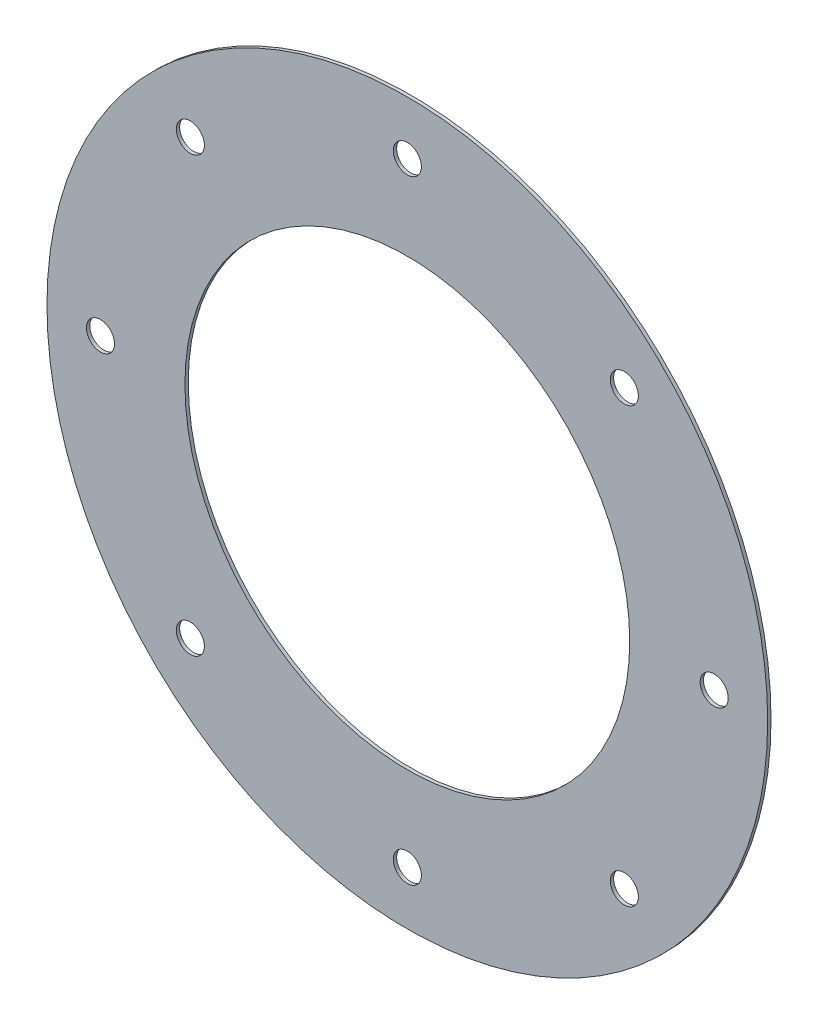
ISO-10303-21;
HEADER;
FILE_DESCRIPTION(('STEP AP214'),'2;1');
FILE_NAME('part.step','',(''),(''),'','','');
FILE_SCHEMA(('AUTOMOTIVE_DESIGN { 1 0 10303 214 1 1 1 1 }'));
ENDSEC;
DATA;
#1=APPLICATION_CONTEXT('core data for automotive mechanical design processes');
#2=APPLICATION_PROTOCOL_DEFINITION('international standard','automotive_design',2000,#1);
#3=PRODUCT_CONTEXT('',#1,'mechanical');
#4=PRODUCT('Part','Part','',(#3));
#5=PRODUCT_RELATED_PRODUCT_CATEGORY('part','',(#4));
#6=PRODUCT_DEFINITION_FORMATION('','',#4);
#7=PRODUCT_DEFINITION_CONTEXT('part definition',#1,'design');
#8=PRODUCT_DEFINITION('design','',#6,#7);
#9=PRODUCT_DEFINITION_SHAPE('','',#8);
#10=(LENGTH_UNIT() NAMED_UNIT(*) SI_UNIT(.MILLI.,.METRE.));
#11=(NAMED_UNIT(*) PLANE_ANGLE_UNIT() SI_UNIT($,.RADIAN.));
#12=(NAMED_UNIT(*) SI_UNIT($,.STERADIAN.) SOLID_ANGLE_UNIT());
#13=UNCERTAINTY_MEASURE_WITH_UNIT(LENGTH_MEASURE(1.E-05),#10,'distance_accuracy_value','');
#14=(GEOMETRIC_REPRESENTATION_CONTEXT(3) GLOBAL_UNCERTAINTY_ASSIGNED_CONTEXT((#13)) GLOBAL_UNIT_ASSIGNED_CONTEXT((#10,
#11,#12)) REPRESENTATION_CONTEXT('',''));
#15=CARTESIAN_POINT('',(0.,0.,0.));
#16=DIRECTION('',(0.,0.,1.));
#17=DIRECTION('',(1.,0.,0.));
#18=AXIS2_PLACEMENT_3D('',#15,#16,#17);
#19=CARTESIAN_POINT('',(0.,0.,0.5));
#20=DIRECTION('',(0.,0.,1.));
#21=DIRECTION('',(1.,0.,0.));
#22=AXIS2_PLACEMENT_3D('',#19,#20,#21);
#23=PLANE('',#22);
#24=CARTESIAN_POINT('',(-45.875,0.,0.5));
#25=DIRECTION('',(0.,0.,1.));
#26=DIRECTION('',(1.,0.,0.));
#27=AXIS2_PLACEMENT_3D('',#24,#25,#26);
#28=CIRCLE('',#27,2.1);
#29=CARTESIAN_POINT('',(-43.775,0.,0.5));
#30=VERTEX_POINT('',#29);
#31=EDGE_CURVE('E108',#30,#30,#28,.T.);
#32=ORIENTED_EDGE('',*,*,#31,.F.);
#33=EDGE_LOOP('',(#32));
#34=FACE_BOUND('',#33,.T.);
#35=CARTESIAN_POINT('',(0.,-45.875,0.5));
#36=DIRECTION('',(0.,0.,1.));
#37=DIRECTION('',(1.,0.,0.));
#38=AXIS2_PLACEMENT_3D('',#35,#36,#37);
#39=CIRCLE('',#38,2.1);
#40=CARTESIAN_POINT('',(2.1,-45.875,0.5));
#41=VERTEX_POINT('',#40);
#42=EDGE_CURVE('E92',#41,#41,#39,.T.);
#43=ORIENTED_EDGE('',*,*,#42,.F.);
#44=EDGE_LOOP('',(#43));
#45=FACE_BOUND('',#44,.T.);
#46=CARTESIAN_POINT('',(45.875,0.,0.5));
#47=DIRECTION('',(0.,0.,1.));
#48=DIRECTION('',(1.,0.,0.));
#49=AXIS2_PLACEMENT_3D('',#46,#47,#48);
#50=CIRCLE('',#49,2.1);
#51=CARTESIAN_POINT('',(47.975,0.,0.5));
#52=VERTEX_POINT('',#51);
#53=EDGE_CURVE('E76',#52,#52,#50,.T.);
#54=ORIENTED_EDGE('',*,*,#53,.F.);
#55=EDGE_LOOP('',(#54));
#56=FACE_BOUND('',#55,.T.);
#57=CARTESIAN_POINT('',(0.,45.875,0.5));
#58=DIRECTION('',(0.,0.,1.));
#59=DIRECTION('',(1.,0.,0.));
#60=AXIS2_PLACEMENT_3D('',#57,#58,#59);
#61=CIRCLE('',#60,2.1);
#62=CARTESIAN_POINT('',(2.1,45.875,0.5));
#63=VERTEX_POINT('',#62);
#64=EDGE_CURVE('E60',#63,#63,#61,.T.);
#65=ORIENTED_EDGE('',*,*,#64,.F.);
#66=EDGE_LOOP('',(#65));
#67=FACE_BOUND('',#66,.T.);
#68=CARTESIAN_POINT('',(0.,0.,0.5));
#69=DIRECTION('',(0.,0.,1.));
#70=DIRECTION('',(1.,0.,0.));
#71=AXIS2_PLACEMENT_3D('',#68,#69,#70);
#72=CIRCLE('',#71,53.875);
#73=CARTESIAN_POINT('',(53.875,0.,0.5));
#74=VERTEX_POINT('',#73);
#75=EDGE_CURVE('E10',#74,#74,#72,.T.);
#76=ORIENTED_EDGE('',*,*,#75,.T.);
#77=EDGE_LOOP('',(#76));
#78=FACE_BOUND('',#77,.T.);
#79=CARTESIAN_POINT('',(0.,0.,0.5));
#80=DIRECTION('',(0.,0.,1.));
#81=DIRECTION('',(1.,0.,0.));
#82=AXIS2_PLACEMENT_3D('',#79,#80,#81);
#83=CIRCLE('',#82,33.25);
#84=CARTESIAN_POINT('',(33.25,0.,0.5));
#85=VERTEX_POINT('',#84);
#86=EDGE_CURVE('E54',#85,#85,#83,.T.);
#87=ORIENTED_EDGE('',*,*,#86,.F.);
#88=EDGE_LOOP('',(#87));
#89=FACE_BOUND('',#88,.T.);
#90=CARTESIAN_POINT('',(32.4385235869329,32.4385235869329,0.5));
#91=DIRECTION('',(0.,0.,1.));
#92=DIRECTION('',(1.,0.,0.));
#93=AXIS2_PLACEMENT_3D('',#90,#91,#92);
#94=CIRCLE('',#93,2.1);
#95=CARTESIAN_POINT('',(34.5385235869329,32.4385235869329,0.5));
#96=VERTEX_POINT('',#95);
#97=EDGE_CURVE('E68',#96,#96,#94,.T.);
#98=ORIENTED_EDGE('',*,*,#97,.F.);
#99=EDGE_LOOP('',(#98));
#100=FACE_BOUND('',#99,.T.);
#101=CARTESIAN_POINT('',(32.4385235869329,-32.4385235869329,0.5));
#102=DIRECTION('',(0.,0.,1.));
#103=DIRECTION('',(1.,0.,0.));
#104=AXIS2_PLACEMENT_3D('',#101,#102,#103);
#105=CIRCLE('',#104,2.1);
#106=CARTESIAN_POINT('',(34.5385235869329,-32.4385235869329,0.5));
#107=VERTEX_POINT('',#106);
#108=EDGE_CURVE('E84',#107,#107,#105,.T.);
#109=ORIENTED_EDGE('',*,*,#108,.F.);
#110=EDGE_LOOP('',(#109));
#111=FACE_BOUND('',#110,.T.);
#112=CARTESIAN_POINT('',(-32.4385235869329,-32.4385235869329,0.5));
#113=DIRECTION('',(0.,0.,1.));
#114=DIRECTION('',(1.,0.,0.));
#115=AXIS2_PLACEMENT_3D('',#112,#113,#114);
#116=CIRCLE('',#115,2.1);
#117=CARTESIAN_POINT('',(-30.3385235869329,-32.4385235869329,0.5));
#118=VERTEX_POINT('',#117);
#119=EDGE_CURVE('E100',#118,#118,#116,.T.);
#120=ORIENTED_EDGE('',*,*,#119,.F.);
#121=EDGE_LOOP('',(#120));
#122=FACE_BOUND('',#121,.T.);
#123=CARTESIAN_POINT('',(-32.4385235869329,32.4385235869329,0.5));
#124=DIRECTION('',(0.,0.,1.));
#125=DIRECTION('',(1.,0.,0.));
#126=AXIS2_PLACEMENT_3D('',#123,#124,#125);
#127=CIRCLE('',#126,2.1);
#128=CARTESIAN_POINT('',(-30.3385235869329,32.4385235869329,0.5));
#129=VERTEX_POINT('',#128);
#130=EDGE_CURVE('E116',#129,#129,#127,.T.);
#131=ORIENTED_EDGE('',*,*,#130,.F.);
#132=EDGE_LOOP('',(#131));
#133=FACE_BOUND('',#132,.T.);
#134=ADVANCED_FACE('F41',(#34,#45,#56,#67,#78,#89,#100,#111,#122,#133),#23,.T.);
#135=CARTESIAN_POINT('',(0.,0.,0.));
#136=DIRECTION('',(0.,0.,1.));
#137=DIRECTION('',(1.,0.,0.));
#138=AXIS2_PLACEMENT_3D('',#135,#136,#137);
#139=PLANE('',#138);
#140=CARTESIAN_POINT('',(0.,0.,0.));
#141=DIRECTION('',(0.,0.,1.));
#142=DIRECTION('',(1.,0.,0.));
#143=AXIS2_PLACEMENT_3D('',#140,#141,#142);
#144=CIRCLE('',#143,53.875);
#145=CARTESIAN_POINT('',(53.875,0.,0.));
#146=VERTEX_POINT('',#145);
#147=EDGE_CURVE('E45',#146,#146,#144,.T.);
#148=ORIENTED_EDGE('',*,*,#147,.F.);
#149=EDGE_LOOP('',(#148));
#150=FACE_BOUND('',#149,.T.);
#151=CARTESIAN_POINT('',(0.,0.,0.));
#152=DIRECTION('',(0.,0.,1.));
#153=DIRECTION('',(1.,0.,0.));
#154=AXIS2_PLACEMENT_3D('',#151,#152,#153);
#155=CIRCLE('',#154,33.25);
#156=CARTESIAN_POINT('',(33.25,0.,0.));
#157=VERTEX_POINT('',#156);
#158=EDGE_CURVE('E56',#157,#157,#155,.T.);
#159=ORIENTED_EDGE('',*,*,#158,.T.);
#160=EDGE_LOOP('',(#159));
#161=FACE_BOUND('',#160,.T.);
#162=CARTESIAN_POINT('',(0.,45.875,0.));
#163=DIRECTION('',(0.,0.,1.));
#164=DIRECTION('',(1.,0.,0.));
#165=AXIS2_PLACEMENT_3D('',#162,#163,#164);
#166=CIRCLE('',#165,2.1);
#167=CARTESIAN_POINT('',(2.1,45.875,0.));
#168=VERTEX_POINT('',#167);
#169=EDGE_CURVE('E64',#168,#168,#166,.T.);
#170=ORIENTED_EDGE('',*,*,#169,.T.);
#171=EDGE_LOOP('',(#170));
#172=FACE_BOUND('',#171,.T.);
#173=CARTESIAN_POINT('',(32.4385235869329,32.4385235869329,0.));
#174=DIRECTION('',(0.,0.,1.));
#175=DIRECTION('',(1.,0.,0.));
#176=AXIS2_PLACEMENT_3D('',#173,#174,#175);
#177=CIRCLE('',#176,2.1);
#178=CARTESIAN_POINT('',(34.5385235869329,32.4385235869329,0.));
#179=VERTEX_POINT('',#178);
#180=EDGE_CURVE('E72',#179,#179,#177,.T.);
#181=ORIENTED_EDGE('',*,*,#180,.T.);
#182=EDGE_LOOP('',(#181));
#183=FACE_BOUND('',#182,.T.);
#184=CARTESIAN_POINT('',(45.875,0.,0.));
#185=DIRECTION('',(0.,0.,1.));
#186=DIRECTION('',(1.,0.,0.));
#187=AXIS2_PLACEMENT_3D('',#184,#185,#186);
#188=CIRCLE('',#187,2.1);
#189=CARTESIAN_POINT('',(47.975,0.,0.));
#190=VERTEX_POINT('',#189);
#191=EDGE_CURVE('E80',#190,#190,#188,.T.);
#192=ORIENTED_EDGE('',*,*,#191,.T.);
#193=EDGE_LOOP('',(#192));
#194=FACE_BOUND('',#193,.T.);
#195=CARTESIAN_POINT('',(32.4385235869329,-32.4385235869329,0.));
#196=DIRECTION('',(0.,0.,1.));
#197=DIRECTION('',(1.,0.,0.));
#198=AXIS2_PLACEMENT_3D('',#195,#196,#197);
#199=CIRCLE('',#198,2.1);
#200=CARTESIAN_POINT('',(34.5385235869329,-32.4385235869329,0.));
#201=VERTEX_POINT('',#200);
#202=EDGE_CURVE('E88',#201,#201,#199,.T.);
#203=ORIENTED_EDGE('',*,*,#202,.T.);
#204=EDGE_LOOP('',(#203));
#205=FACE_BOUND('',#204,.T.);
#206=CARTESIAN_POINT('',(0.,-45.875,0.));
#207=DIRECTION('',(0.,0.,1.));
#208=DIRECTION('',(1.,0.,0.));
#209=AXIS2_PLACEMENT_3D('',#206,#207,#208);
#210=CIRCLE('',#209,2.1);
#211=CARTESIAN_POINT('',(2.1,-45.875,0.));
#212=VERTEX_POINT('',#211);
#213=EDGE_CURVE('E96',#212,#212,#210,.T.);
#214=ORIENTED_EDGE('',*,*,#213,.T.);
#215=EDGE_LOOP('',(#214));
#216=FACE_BOUND('',#215,.T.);
#217=CARTESIAN_POINT('',(-32.4385235869329,-32.4385235869329,0.));
#218=DIRECTION('',(0.,0.,1.));
#219=DIRECTION('',(1.,0.,0.));
#220=AXIS2_PLACEMENT_3D('',#217,#218,#219);
#221=CIRCLE('',#220,2.1);
#222=CARTESIAN_POINT('',(-30.3385235869329,-32.4385235869329,0.));
#223=VERTEX_POINT('',#222);
#224=EDGE_CURVE('E104',#223,#223,#221,.T.);
#225=ORIENTED_EDGE('',*,*,#224,.T.);
#226=EDGE_LOOP('',(#225));
#227=FACE_BOUND('',#226,.T.);
#228=CARTESIAN_POINT('',(-45.875,0.,0.));
#229=DIRECTION('',(0.,0.,1.));
#230=DIRECTION('',(1.,0.,0.));
#231=AXIS2_PLACEMENT_3D('',#228,#229,#230);
#232=CIRCLE('',#231,2.1);
#233=CARTESIAN_POINT('',(-43.775,0.,0.));
#234=VERTEX_POINT('',#233);
#235=EDGE_CURVE('E112',#234,#234,#232,.T.);
#236=ORIENTED_EDGE('',*,*,#235,.T.);
#237=EDGE_LOOP('',(#236));
#238=FACE_BOUND('',#237,.T.);
#239=CARTESIAN_POINT('',(-32.4385235869329,32.4385235869329,0.));
#240=DIRECTION('',(0.,0.,1.));
#241=DIRECTION('',(1.,0.,0.));
#242=AXIS2_PLACEMENT_3D('',#239,#240,#241);
#243=CIRCLE('',#242,2.1);
#244=CARTESIAN_POINT('',(-30.3385235869329,32.4385235869329,0.));
#245=VERTEX_POINT('',#244);
#246=EDGE_CURVE('E120',#245,#245,#243,.T.);
#247=ORIENTED_EDGE('',*,*,#246,.T.);
#248=EDGE_LOOP('',(#247));
#249=FACE_BOUND('',#248,.T.);
#250=ADVANCED_FACE('F132',(#150,#161,#172,#183,#194,#205,#216,#227,#238,#249),#139,.F.);
#251=CARTESIAN_POINT('',(0.,0.,0.5));
#252=DIRECTION('',(0.,0.,-1.));
#253=DIRECTION('',(-1.,0.,0.));
#254=AXIS2_PLACEMENT_3D('',#251,#252,#253);
#255=CYLINDRICAL_SURFACE('',#254,53.875);
#256=ORIENTED_EDGE('',*,*,#75,.F.);
#257=EDGE_LOOP('',(#256));
#258=FACE_BOUND('',#257,.T.);
#259=ORIENTED_EDGE('',*,*,#147,.T.);
#260=EDGE_LOOP('',(#259));
#261=FACE_BOUND('',#260,.T.);
#262=ADVANCED_FACE('F43',(#258,#261),#255,.T.);
#263=CARTESIAN_POINT('',(0.,0.,0.5));
#264=DIRECTION('',(0.,0.,-1.));
#265=DIRECTION('',(-1.,0.,0.));
#266=AXIS2_PLACEMENT_3D('',#263,#264,#265);
#267=CYLINDRICAL_SURFACE('',#266,33.25);
#268=ORIENTED_EDGE('',*,*,#86,.T.);
#269=EDGE_LOOP('',(#268));
#270=FACE_BOUND('',#269,.T.);
#271=ORIENTED_EDGE('',*,*,#158,.F.);
#272=EDGE_LOOP('',(#271));
#273=FACE_BOUND('',#272,.T.);
#274=ADVANCED_FACE('F142',(#270,#273),#267,.F.);
#275=CARTESIAN_POINT('',(0.,45.875,0.5));
#276=DIRECTION('',(0.,0.,-1.));
#277=DIRECTION('',(-1.,0.,0.));
#278=AXIS2_PLACEMENT_3D('',#275,#276,#277);
#279=CYLINDRICAL_SURFACE('',#278,2.1);
#280=ORIENTED_EDGE('',*,*,#64,.T.);
#281=EDGE_LOOP('',(#280));
#282=FACE_BOUND('',#281,.T.);
#283=ORIENTED_EDGE('',*,*,#169,.F.);
#284=EDGE_LOOP('',(#283));
#285=FACE_BOUND('',#284,.T.);
#286=ADVANCED_FACE('F145',(#282,#285),#279,.F.);
#287=CARTESIAN_POINT('',(32.4385235869329,32.4385235869329,0.5));
#288=DIRECTION('',(0.,0.,-1.));
#289=DIRECTION('',(-1.,0.,0.));
#290=AXIS2_PLACEMENT_3D('',#287,#288,#289);
#291=CYLINDRICAL_SURFACE('',#290,2.1);
#292=ORIENTED_EDGE('',*,*,#97,.T.);
#293=EDGE_LOOP('',(#292));
#294=FACE_BOUND('',#293,.T.);
#295=ORIENTED_EDGE('',*,*,#180,.F.);
#296=EDGE_LOOP('',(#295));
#297=FACE_BOUND('',#296,.T.);
#298=ADVANCED_FACE('F149',(#294,#297),#291,.F.);
#299=CARTESIAN_POINT('',(45.875,0.,0.5));
#300=DIRECTION('',(0.,0.,-1.));
#301=DIRECTION('',(-1.,0.,0.));
#302=AXIS2_PLACEMENT_3D('',#299,#300,#301);
#303=CYLINDRICAL_SURFACE('',#302,2.1);
#304=ORIENTED_EDGE('',*,*,#53,.T.);
#305=EDGE_LOOP('',(#304));
#306=FACE_BOUND('',#305,.T.);
#307=ORIENTED_EDGE('',*,*,#191,.F.);
#308=EDGE_LOOP('',(#307));
#309=FACE_BOUND('',#308,.T.);
#310=ADVANCED_FACE('F153',(#306,#309),#303,.F.);
#311=CARTESIAN_POINT('',(32.4385235869329,-32.4385235869329,0.5));
#312=DIRECTION('',(0.,0.,-1.));
#313=DIRECTION('',(-1.,0.,0.));
#314=AXIS2_PLACEMENT_3D('',#311,#312,#313);
#315=CYLINDRICAL_SURFACE('',#314,2.1);
#316=ORIENTED_EDGE('',*,*,#108,.T.);
#317=EDGE_LOOP('',(#316));
#318=FACE_BOUND('',#317,.T.);
#319=ORIENTED_EDGE('',*,*,#202,.F.);
#320=EDGE_LOOP('',(#319));
#321=FACE_BOUND('',#320,.T.);
#322=ADVANCED_FACE('F157',(#318,#321),#315,.F.);
#323=CARTESIAN_POINT('',(0.,-45.875,0.5));
#324=DIRECTION('',(0.,0.,-1.));
#325=DIRECTION('',(-1.,0.,0.));
#326=AXIS2_PLACEMENT_3D('',#323,#324,#325);
#327=CYLINDRICAL_SURFACE('',#326,2.1);
#328=ORIENTED_EDGE('',*,*,#42,.T.);
#329=EDGE_LOOP('',(#328));
#330=FACE_BOUND('',#329,.T.);
#331=ORIENTED_EDGE('',*,*,#213,.F.);
#332=EDGE_LOOP('',(#331));
#333=FACE_BOUND('',#332,.T.);
#334=ADVANCED_FACE('F161',(#330,#333),#327,.F.);
#335=CARTESIAN_POINT('',(-32.4385235869329,-32.4385235869329,0.5));
#336=DIRECTION('',(0.,0.,-1.));
#337=DIRECTION('',(-1.,0.,0.));
#338=AXIS2_PLACEMENT_3D('',#335,#336,#337);
#339=CYLINDRICAL_SURFACE('',#338,2.1);
#340=ORIENTED_EDGE('',*,*,#119,.T.);
#341=EDGE_LOOP('',(#340));
#342=FACE_BOUND('',#341,.T.);
#343=ORIENTED_EDGE('',*,*,#224,.F.);
#344=EDGE_LOOP('',(#343));
#345=FACE_BOUND('',#344,.T.);
#346=ADVANCED_FACE('F165',(#342,#345),#339,.F.);
#347=CARTESIAN_POINT('',(-45.875,0.,0.5));
#348=DIRECTION('',(0.,0.,-1.));
#349=DIRECTION('',(-1.,0.,0.));
#350=AXIS2_PLACEMENT_3D('',#347,#348,#349);
#351=CYLINDRICAL_SURFACE('',#350,2.1);
#352=ORIENTED_EDGE('',*,*,#31,.T.);
#353=EDGE_LOOP('',(#352));
#354=FACE_BOUND('',#353,.T.);
#355=ORIENTED_EDGE('',*,*,#235,.F.);
#356=EDGE_LOOP('',(#355));
#357=FACE_BOUND('',#356,.T.);
#358=ADVANCED_FACE('F169',(#354,#357),#351,.F.);
#359=CARTESIAN_POINT('',(-32.4385235869329,32.4385235869329,0.5));
#360=DIRECTION('',(0.,0.,-1.));
#361=DIRECTION('',(-1.,0.,0.));
#362=AXIS2_PLACEMENT_3D('',#359,#360,#361);
#363=CYLINDRICAL_SURFACE('',#362,2.1);
#364=ORIENTED_EDGE('',*,*,#130,.T.);
#365=EDGE_LOOP('',(#364));
#366=FACE_BOUND('',#365,.T.);
#367=ORIENTED_EDGE('',*,*,#246,.F.);
#368=EDGE_LOOP('',(#367));
#369=FACE_BOUND('',#368,.T.);
#370=ADVANCED_FACE('F128',(#366,#369),#363,.F.);
#371=CLOSED_SHELL('',(#134,#250,#262,#274,#286,#298,#310,#322,#334,#346,#358,#370));
#372=MANIFOLD_SOLID_BREP('B2',#371);
#373=ADVANCED_BREP_SHAPE_REPRESENTATION('',(#18,#372),#14);
#374=SHAPE_DEFINITION_REPRESENTATION(#9,#373);
ENDSEC;
END-ISO-10303-21;
